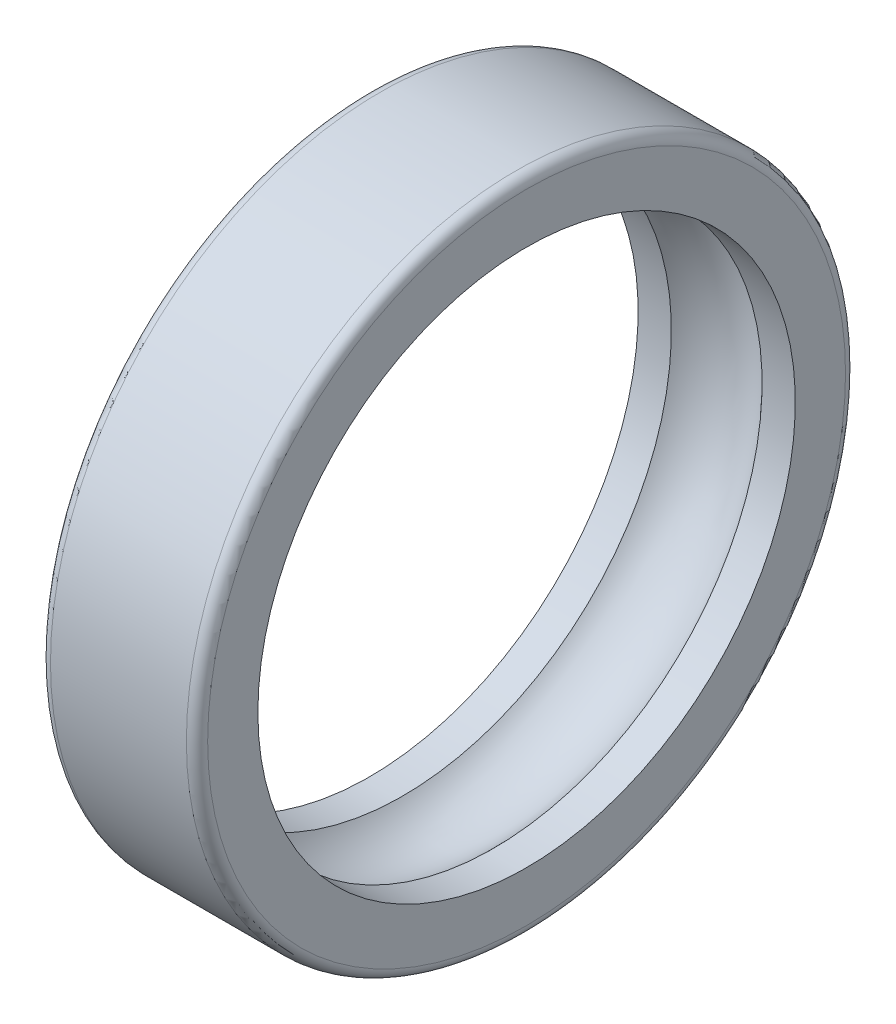
ISO-10303-21;
HEADER;
FILE_DESCRIPTION(('STEP AP214'),'2;1');
FILE_NAME('part.step','',(''),(''),'','','');
FILE_SCHEMA(('AUTOMOTIVE_DESIGN { 1 0 10303 214 1 1 1 1 }'));
ENDSEC;
DATA;
#1=APPLICATION_CONTEXT('core data for automotive mechanical design processes');
#2=APPLICATION_PROTOCOL_DEFINITION('international standard','automotive_design',2000,#1);
#3=PRODUCT_CONTEXT('',#1,'mechanical');
#4=PRODUCT('Part','Part','',(#3));
#5=PRODUCT_RELATED_PRODUCT_CATEGORY('part','',(#4));
#6=PRODUCT_DEFINITION_FORMATION('','',#4);
#7=PRODUCT_DEFINITION_CONTEXT('part definition',#1,'design');
#8=PRODUCT_DEFINITION('design','',#6,#7);
#9=PRODUCT_DEFINITION_SHAPE('','',#8);
#10=(LENGTH_UNIT() NAMED_UNIT(*) SI_UNIT(.MILLI.,.METRE.));
#11=(NAMED_UNIT(*) PLANE_ANGLE_UNIT() SI_UNIT($,.RADIAN.));
#12=(NAMED_UNIT(*) SI_UNIT($,.STERADIAN.) SOLID_ANGLE_UNIT());
#13=UNCERTAINTY_MEASURE_WITH_UNIT(LENGTH_MEASURE(1.E-05),#10,'distance_accuracy_value','');
#14=(GEOMETRIC_REPRESENTATION_CONTEXT(3) GLOBAL_UNCERTAINTY_ASSIGNED_CONTEXT((#13)) GLOBAL_UNIT_ASSIGNED_CONTEXT((#10,
#11,#12)) REPRESENTATION_CONTEXT('',''));
#15=CARTESIAN_POINT('',(0.,0.,0.));
#16=DIRECTION('',(0.,0.,1.));
#17=DIRECTION('',(1.,0.,0.));
#18=AXIS2_PLACEMENT_3D('',#15,#16,#17);
#19=CARTESIAN_POINT('',(-155.,530.,0.));
#20=DIRECTION('',(1.,0.,0.));
#21=DIRECTION('',(0.,0.,-1.));
#22=AXIS2_PLACEMENT_3D('',#19,#20,#21);
#23=PLANE('',#22);
#24=CARTESIAN_POINT('',(-155.,0.,0.));
#25=DIRECTION('',(1.,0.,0.));
#26=DIRECTION('',(0.,0.,-1.));
#27=AXIS2_PLACEMENT_3D('',#24,#25,#26);
#28=CIRCLE('',#27,629.);
#29=CARTESIAN_POINT('',(-155.,0.,-629.));
#30=VERTEX_POINT('',#29);
#31=EDGE_CURVE('E10',#30,#30,#28,.F.);
#32=ORIENTED_EDGE('',*,*,#31,.T.);
#33=EDGE_LOOP('',(#32));
#34=FACE_BOUND('',#33,.T.);
#35=CARTESIAN_POINT('',(-155.,0.,0.));
#36=DIRECTION('',(-1.,0.,0.));
#37=DIRECTION('',(0.,0.,1.));
#38=AXIS2_PLACEMENT_3D('',#35,#36,#37);
#39=CIRCLE('',#38,530.);
#40=CARTESIAN_POINT('',(-155.,0.,530.));
#41=VERTEX_POINT('',#40);
#42=EDGE_CURVE('E60',#41,#41,#39,.T.);
#43=ORIENTED_EDGE('',*,*,#42,.F.);
#44=EDGE_LOOP('',(#43));
#45=FACE_BOUND('',#44,.T.);
#46=ADVANCED_FACE('F31',(#34,#45),#23,.F.);
#47=CARTESIAN_POINT('',(-124.426605504587,0.,0.));
#48=DIRECTION('',(-1.,0.,0.));
#49=DIRECTION('',(0.,0.,1.));
#50=AXIS2_PLACEMENT_3D('',#47,#48,#49);
#51=CYLINDRICAL_SURFACE('',#50,650.);
#52=CARTESIAN_POINT('',(134.,0.,0.));
#53=DIRECTION('',(-1.,0.,0.));
#54=DIRECTION('',(0.,0.,1.));
#55=AXIS2_PLACEMENT_3D('',#52,#53,#54);
#56=CIRCLE('',#55,650.);
#57=CARTESIAN_POINT('',(134.,0.,650.));
#58=VERTEX_POINT('',#57);
#59=EDGE_CURVE('E42',#58,#58,#56,.T.);
#60=ORIENTED_EDGE('',*,*,#59,.T.);
#61=EDGE_LOOP('',(#60));
#62=FACE_BOUND('',#61,.T.);
#63=CARTESIAN_POINT('',(-134.,0.,0.));
#64=DIRECTION('',(1.,0.,0.));
#65=DIRECTION('',(0.,0.,-1.));
#66=AXIS2_PLACEMENT_3D('',#63,#64,#65);
#67=CIRCLE('',#66,650.);
#68=CARTESIAN_POINT('',(-134.,0.,-650.));
#69=VERTEX_POINT('',#68);
#70=EDGE_CURVE('E46',#69,#69,#67,.T.);
#71=ORIENTED_EDGE('',*,*,#70,.T.);
#72=EDGE_LOOP('',(#71));
#73=FACE_BOUND('',#72,.T.);
#74=ADVANCED_FACE('F67',(#62,#73),#51,.T.);
#75=CARTESIAN_POINT('',(155.,530.,0.));
#76=DIRECTION('',(-1.,0.,0.));
#77=DIRECTION('',(0.,0.,1.));
#78=AXIS2_PLACEMENT_3D('',#75,#76,#77);
#79=PLANE('',#78);
#80=CARTESIAN_POINT('',(155.,0.,0.));
#81=DIRECTION('',(-1.,0.,0.));
#82=DIRECTION('',(0.,0.,1.));
#83=AXIS2_PLACEMENT_3D('',#80,#81,#82);
#84=CIRCLE('',#83,629.);
#85=CARTESIAN_POINT('',(155.,0.,629.));
#86=VERTEX_POINT('',#85);
#87=EDGE_CURVE('E38',#86,#86,#84,.F.);
#88=ORIENTED_EDGE('',*,*,#87,.T.);
#89=EDGE_LOOP('',(#88));
#90=FACE_BOUND('',#89,.T.);
#91=CARTESIAN_POINT('',(155.,0.,0.));
#92=DIRECTION('',(-1.,0.,0.));
#93=DIRECTION('',(0.,0.,1.));
#94=AXIS2_PLACEMENT_3D('',#91,#92,#93);
#95=CIRCLE('',#94,530.);
#96=CARTESIAN_POINT('',(155.,0.,530.));
#97=VERTEX_POINT('',#96);
#98=EDGE_CURVE('E51',#97,#97,#95,.T.);
#99=ORIENTED_EDGE('',*,*,#98,.T.);
#100=EDGE_LOOP('',(#99));
#101=FACE_BOUND('',#100,.T.);
#102=ADVANCED_FACE('F72',(#90,#101),#79,.F.);
#103=CARTESIAN_POINT('',(-124.426605504587,0.,0.));
#104=DIRECTION('',(-1.,0.,0.));
#105=DIRECTION('',(0.,0.,1.));
#106=AXIS2_PLACEMENT_3D('',#103,#104,#105);
#107=CYLINDRICAL_SURFACE('',#106,530.);
#108=ORIENTED_EDGE('',*,*,#98,.F.);
#109=EDGE_LOOP('',(#108));
#110=FACE_BOUND('',#109,.T.);
#111=CARTESIAN_POINT('',(89.4427190999916,0.,0.));
#112=DIRECTION('',(-1.,0.,0.));
#113=DIRECTION('',(0.,0.,1.));
#114=AXIS2_PLACEMENT_3D('',#111,#112,#113);
#115=CIRCLE('',#114,530.);
#116=CARTESIAN_POINT('',(89.4427190999916,0.,530.));
#117=VERTEX_POINT('',#116);
#118=EDGE_CURVE('E54',#117,#117,#115,.T.);
#119=ORIENTED_EDGE('',*,*,#118,.T.);
#120=EDGE_LOOP('',(#119));
#121=FACE_BOUND('',#120,.T.);
#122=ADVANCED_FACE('F95',(#110,#121),#107,.F.);
#123=CARTESIAN_POINT('',(0.,0.,0.));
#124=DIRECTION('',(-1.,0.,0.));
#125=DIRECTION('',(0.,0.,1.));
#126=AXIS2_PLACEMENT_3D('',#123,#124,#125);
#127=TOROIDAL_SURFACE('',#126,450.,120.);
#128=ORIENTED_EDGE('',*,*,#118,.F.);
#129=EDGE_LOOP('',(#128));
#130=FACE_BOUND('',#129,.T.);
#131=CARTESIAN_POINT('',(-89.4427190999916,0.,0.));
#132=DIRECTION('',(-1.,0.,0.));
#133=DIRECTION('',(0.,0.,1.));
#134=AXIS2_PLACEMENT_3D('',#131,#132,#133);
#135=CIRCLE('',#134,530.);
#136=CARTESIAN_POINT('',(-89.4427190999916,0.,530.));
#137=VERTEX_POINT('',#136);
#138=EDGE_CURVE('E57',#137,#137,#135,.T.);
#139=ORIENTED_EDGE('',*,*,#138,.T.);
#140=EDGE_LOOP('',(#139));
#141=FACE_BOUND('',#140,.T.);
#142=ADVANCED_FACE('F84',(#130,#141),#127,.F.);
#143=CARTESIAN_POINT('',(-124.426605504587,0.,0.));
#144=DIRECTION('',(-1.,0.,0.));
#145=DIRECTION('',(0.,0.,1.));
#146=AXIS2_PLACEMENT_3D('',#143,#144,#145);
#147=CYLINDRICAL_SURFACE('',#146,530.);
#148=ORIENTED_EDGE('',*,*,#138,.F.);
#149=EDGE_LOOP('',(#148));
#150=FACE_BOUND('',#149,.T.);
#151=ORIENTED_EDGE('',*,*,#42,.T.);
#152=EDGE_LOOP('',(#151));
#153=FACE_BOUND('',#152,.T.);
#154=ADVANCED_FACE('F64',(#150,#153),#147,.F.);
#155=CARTESIAN_POINT('',(134.,0.,0.));
#156=DIRECTION('',(-1.,0.,0.));
#157=DIRECTION('',(0.,0.,1.));
#158=AXIS2_PLACEMENT_3D('',#155,#156,#157);
#159=TOROIDAL_SURFACE('',#158,629.,21.);
#160=ORIENTED_EDGE('',*,*,#87,.F.);
#161=EDGE_LOOP('',(#160));
#162=FACE_BOUND('',#161,.T.);
#163=ORIENTED_EDGE('',*,*,#59,.F.);
#164=EDGE_LOOP('',(#163));
#165=FACE_BOUND('',#164,.T.);
#166=ADVANCED_FACE('F76',(#162,#165),#159,.T.);
#167=CARTESIAN_POINT('',(-134.,0.,0.));
#168=DIRECTION('',(1.,0.,0.));
#169=DIRECTION('',(0.,0.,-1.));
#170=AXIS2_PLACEMENT_3D('',#167,#168,#169);
#171=TOROIDAL_SURFACE('',#170,629.,21.);
#172=ORIENTED_EDGE('',*,*,#70,.F.);
#173=EDGE_LOOP('',(#172));
#174=FACE_BOUND('',#173,.T.);
#175=ORIENTED_EDGE('',*,*,#31,.F.);
#176=EDGE_LOOP('',(#175));
#177=FACE_BOUND('',#176,.T.);
#178=ADVANCED_FACE('F33',(#174,#177),#171,.T.);
#179=CLOSED_SHELL('',(#46,#74,#102,#122,#142,#154,#166,#178));
#180=MANIFOLD_SOLID_BREP('B2',#179);
#181=ADVANCED_BREP_SHAPE_REPRESENTATION('',(#18,#180),#14);
#182=SHAPE_DEFINITION_REPRESENTATION(#9,#181);
ENDSEC;
END-ISO-10303-21;
